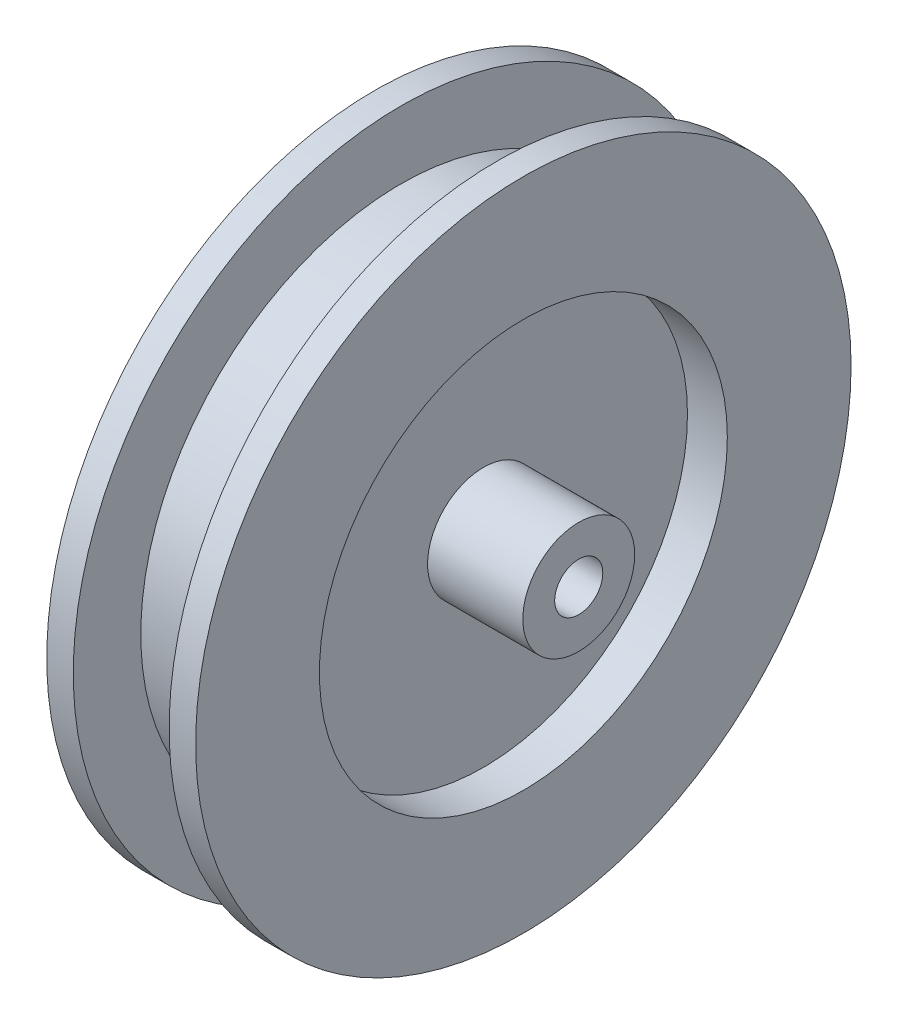
ISO-10303-21;
HEADER;
FILE_DESCRIPTION(('STEP AP214'),'2;1');
FILE_NAME('part.step','',(''),(''),'','','');
FILE_SCHEMA(('AUTOMOTIVE_DESIGN { 1 0 10303 214 1 1 1 1 }'));
ENDSEC;
DATA;
#1=APPLICATION_CONTEXT('core data for automotive mechanical design processes');
#2=APPLICATION_PROTOCOL_DEFINITION('international standard','automotive_design',2000,#1);
#3=PRODUCT_CONTEXT('',#1,'mechanical');
#4=PRODUCT('Part','Part','',(#3));
#5=PRODUCT_RELATED_PRODUCT_CATEGORY('part','',(#4));
#6=PRODUCT_DEFINITION_FORMATION('','',#4);
#7=PRODUCT_DEFINITION_CONTEXT('part definition',#1,'design');
#8=PRODUCT_DEFINITION('design','',#6,#7);
#9=PRODUCT_DEFINITION_SHAPE('','',#8);
#10=(LENGTH_UNIT() NAMED_UNIT(*) SI_UNIT(.MILLI.,.METRE.));
#11=(NAMED_UNIT(*) PLANE_ANGLE_UNIT() SI_UNIT($,.RADIAN.));
#12=(NAMED_UNIT(*) SI_UNIT($,.STERADIAN.) SOLID_ANGLE_UNIT());
#13=UNCERTAINTY_MEASURE_WITH_UNIT(LENGTH_MEASURE(1.E-05),#10,'distance_accuracy_value','');
#14=(GEOMETRIC_REPRESENTATION_CONTEXT(3) GLOBAL_UNCERTAINTY_ASSIGNED_CONTEXT((#13)) GLOBAL_UNIT_ASSIGNED_CONTEXT((#10,
#11,#12)) REPRESENTATION_CONTEXT('',''));
#15=CARTESIAN_POINT('',(0.,0.,0.));
#16=DIRECTION('',(0.,0.,1.));
#17=DIRECTION('',(1.,0.,0.));
#18=AXIS2_PLACEMENT_3D('',#15,#16,#17);
#19=CARTESIAN_POINT('',(8.0518,0.,0.));
#20=DIRECTION('',(1.,0.,0.));
#21=DIRECTION('',(0.,0.,-1.));
#22=AXIS2_PLACEMENT_3D('',#19,#20,#21);
#23=PLANE('',#22);
#24=CARTESIAN_POINT('',(8.0518,0.,0.));
#25=DIRECTION('',(1.,0.,0.));
#26=DIRECTION('',(0.,0.,-1.));
#27=AXIS2_PLACEMENT_3D('',#24,#25,#26);
#28=CIRCLE('',#27,47.46625);
#29=CARTESIAN_POINT('',(8.0518,0.,-47.46625));
#30=VERTEX_POINT('',#29);
#31=EDGE_CURVE('E48',#30,#30,#28,.T.);
#32=ORIENTED_EDGE('',*,*,#31,.T.);
#33=EDGE_LOOP('',(#32));
#34=FACE_BOUND('',#33,.T.);
#35=CARTESIAN_POINT('',(8.0518,0.,0.));
#36=DIRECTION('',(1.,0.,0.));
#37=DIRECTION('',(0.,0.,-1.));
#38=AXIS2_PLACEMENT_3D('',#35,#36,#37);
#39=CIRCLE('',#38,13.0175);
#40=CARTESIAN_POINT('',(8.0518,0.,-13.0175));
#41=VERTEX_POINT('',#40);
#42=EDGE_CURVE('E139',#41,#41,#39,.T.);
#43=ORIENTED_EDGE('',*,*,#42,.F.);
#44=EDGE_LOOP('',(#43));
#45=FACE_BOUND('',#44,.T.);
#46=ADVANCED_FACE('F35',(#34,#45),#23,.T.);
#47=CARTESIAN_POINT('',(17.3228,0.,0.));
#48=DIRECTION('',(-1.,0.,0.));
#49=DIRECTION('',(0.,0.,1.));
#50=AXIS2_PLACEMENT_3D('',#47,#48,#49);
#51=CYLINDRICAL_SURFACE('',#50,76.2635);
#52=CARTESIAN_POINT('',(11.1506,0.,0.));
#53=DIRECTION('',(1.,0.,0.));
#54=DIRECTION('',(0.,0.,-1.));
#55=AXIS2_PLACEMENT_3D('',#52,#53,#54);
#56=CIRCLE('',#55,76.2635);
#57=CARTESIAN_POINT('',(11.1506,0.,-76.2635));
#58=VERTEX_POINT('',#57);
#59=EDGE_CURVE('E39',#58,#58,#56,.T.);
#60=ORIENTED_EDGE('',*,*,#59,.T.);
#61=EDGE_LOOP('',(#60));
#62=FACE_BOUND('',#61,.T.);
#63=CARTESIAN_POINT('',(17.3228,0.,0.));
#64=DIRECTION('',(1.,0.,0.));
#65=DIRECTION('',(0.,0.,-1.));
#66=AXIS2_PLACEMENT_3D('',#63,#64,#65);
#67=CIRCLE('',#66,76.2635);
#68=CARTESIAN_POINT('',(17.3228,0.,-76.2635));
#69=VERTEX_POINT('',#68);
#70=EDGE_CURVE('E12',#69,#69,#67,.T.);
#71=ORIENTED_EDGE('',*,*,#70,.F.);
#72=EDGE_LOOP('',(#71));
#73=FACE_BOUND('',#72,.T.);
#74=ADVANCED_FACE('F37',(#62,#73),#51,.T.);
#75=CARTESIAN_POINT('',(17.3228,0.,0.));
#76=DIRECTION('',(1.,0.,0.));
#77=DIRECTION('',(0.,0.,-1.));
#78=AXIS2_PLACEMENT_3D('',#75,#76,#77);
#79=PLANE('',#78);
#80=CARTESIAN_POINT('',(17.3228,0.,0.));
#81=DIRECTION('',(1.,0.,0.));
#82=DIRECTION('',(0.,0.,-1.));
#83=AXIS2_PLACEMENT_3D('',#80,#81,#82);
#84=CIRCLE('',#83,47.46625);
#85=CARTESIAN_POINT('',(17.3228,0.,-47.46625));
#86=VERTEX_POINT('',#85);
#87=EDGE_CURVE('E51',#86,#86,#84,.T.);
#88=ORIENTED_EDGE('',*,*,#87,.F.);
#89=EDGE_LOOP('',(#88));
#90=FACE_BOUND('',#89,.T.);
#91=ORIENTED_EDGE('',*,*,#70,.T.);
#92=EDGE_LOOP('',(#91));
#93=FACE_BOUND('',#92,.T.);
#94=ADVANCED_FACE('F82',(#90,#93),#79,.T.);
#95=CARTESIAN_POINT('',(8.0518,0.,0.));
#96=DIRECTION('',(1.,0.,0.));
#97=DIRECTION('',(0.,0.,-1.));
#98=AXIS2_PLACEMENT_3D('',#95,#96,#97);
#99=CYLINDRICAL_SURFACE('',#98,47.46625);
#100=ORIENTED_EDGE('',*,*,#31,.F.);
#101=EDGE_LOOP('',(#100));
#102=FACE_BOUND('',#101,.T.);
#103=ORIENTED_EDGE('',*,*,#87,.T.);
#104=EDGE_LOOP('',(#103));
#105=FACE_BOUND('',#104,.T.);
#106=ADVANCED_FACE('F80',(#102,#105),#99,.F.);
#107=CARTESIAN_POINT('',(11.1506,0.,0.));
#108=DIRECTION('',(1.,0.,0.));
#109=DIRECTION('',(0.,0.,-1.));
#110=AXIS2_PLACEMENT_3D('',#107,#108,#109);
#111=PLANE('',#110);
#112=CARTESIAN_POINT('',(11.1506,0.,0.));
#113=DIRECTION('',(1.,0.,0.));
#114=DIRECTION('',(0.,0.,-1.));
#115=AXIS2_PLACEMENT_3D('',#112,#113,#114);
#116=CIRCLE('',#115,60.5536);
#117=CARTESIAN_POINT('',(11.1506,0.,-60.5536));
#118=VERTEX_POINT('',#117);
#119=EDGE_CURVE('E61',#118,#118,#116,.T.);
#120=ORIENTED_EDGE('',*,*,#119,.T.);
#121=EDGE_LOOP('',(#120));
#122=FACE_BOUND('',#121,.T.);
#123=ORIENTED_EDGE('',*,*,#59,.F.);
#124=EDGE_LOOP('',(#123));
#125=FACE_BOUND('',#124,.T.);
#126=ADVANCED_FACE('F89',(#122,#125),#111,.F.);
#127=CARTESIAN_POINT('',(-11.1506,0.,0.));
#128=DIRECTION('',(1.,0.,0.));
#129=DIRECTION('',(0.,0.,-1.));
#130=AXIS2_PLACEMENT_3D('',#127,#128,#129);
#131=PLANE('',#130);
#132=CARTESIAN_POINT('',(-11.1506,0.,0.));
#133=DIRECTION('',(1.,0.,0.));
#134=DIRECTION('',(0.,0.,-1.));
#135=AXIS2_PLACEMENT_3D('',#132,#133,#134);
#136=CIRCLE('',#135,60.5536);
#137=CARTESIAN_POINT('',(-11.1506,0.,-60.5536));
#138=VERTEX_POINT('',#137);
#139=EDGE_CURVE('E55',#138,#138,#136,.F.);
#140=ORIENTED_EDGE('',*,*,#139,.T.);
#141=EDGE_LOOP('',(#140));
#142=FACE_BOUND('',#141,.T.);
#143=CARTESIAN_POINT('',(-11.1506,0.,0.));
#144=DIRECTION('',(1.,0.,0.));
#145=DIRECTION('',(0.,0.,-1.));
#146=AXIS2_PLACEMENT_3D('',#143,#144,#145);
#147=CIRCLE('',#146,76.2635);
#148=CARTESIAN_POINT('',(-11.1506,0.,-76.2635));
#149=VERTEX_POINT('',#148);
#150=EDGE_CURVE('E53',#149,#149,#147,.T.);
#151=ORIENTED_EDGE('',*,*,#150,.T.);
#152=EDGE_LOOP('',(#151));
#153=FACE_BOUND('',#152,.T.);
#154=ADVANCED_FACE('F112',(#142,#153),#131,.T.);
#155=CARTESIAN_POINT('',(-236.913180618821,0.,0.));
#156=DIRECTION('',(1.,0.,0.));
#157=DIRECTION('',(0.,0.,-1.));
#158=AXIS2_PLACEMENT_3D('',#155,#156,#157);
#159=CYLINDRICAL_SURFACE('',#158,60.5536);
#160=ORIENTED_EDGE('',*,*,#139,.F.);
#161=EDGE_LOOP('',(#160));
#162=FACE_BOUND('',#161,.T.);
#163=ORIENTED_EDGE('',*,*,#119,.F.);
#164=EDGE_LOOP('',(#163));
#165=FACE_BOUND('',#164,.T.);
#166=ADVANCED_FACE('F108',(#162,#165),#159,.T.);
#167=CARTESIAN_POINT('',(1.4732,0.,0.));
#168=DIRECTION('',(1.,0.,0.));
#169=DIRECTION('',(0.,0.,-1.));
#170=AXIS2_PLACEMENT_3D('',#167,#168,#169);
#171=PLANE('',#170);
#172=CARTESIAN_POINT('',(1.4732,0.,0.));
#173=DIRECTION('',(1.,0.,0.));
#174=DIRECTION('',(0.,0.,-1.));
#175=AXIS2_PLACEMENT_3D('',#172,#173,#174);
#176=CIRCLE('',#175,5.59435);
#177=CARTESIAN_POINT('',(1.4732,0.,-5.59435));
#178=VERTEX_POINT('',#177);
#179=EDGE_CURVE('E138',#178,#178,#176,.T.);
#180=ORIENTED_EDGE('',*,*,#179,.T.);
#181=EDGE_LOOP('',(#180));
#182=FACE_BOUND('',#181,.T.);
#183=CARTESIAN_POINT('',(1.4732,0.,0.));
#184=DIRECTION('',(1.,0.,0.));
#185=DIRECTION('',(0.,0.,-1.));
#186=AXIS2_PLACEMENT_3D('',#183,#184,#185);
#187=CIRCLE('',#186,47.46625);
#188=CARTESIAN_POINT('',(1.4732,0.,-47.46625));
#189=VERTEX_POINT('',#188);
#190=EDGE_CURVE('E70',#189,#189,#187,.T.);
#191=ORIENTED_EDGE('',*,*,#190,.F.);
#192=EDGE_LOOP('',(#191));
#193=FACE_BOUND('',#192,.T.);
#194=ADVANCED_FACE('F104',(#182,#193),#171,.F.);
#195=CARTESIAN_POINT('',(1.4732,0.,0.));
#196=DIRECTION('',(-1.,0.,0.));
#197=DIRECTION('',(0.,0.,1.));
#198=AXIS2_PLACEMENT_3D('',#195,#196,#197);
#199=CYLINDRICAL_SURFACE('',#198,47.46625);
#200=ORIENTED_EDGE('',*,*,#190,.T.);
#201=EDGE_LOOP('',(#200));
#202=FACE_BOUND('',#201,.T.);
#203=CARTESIAN_POINT('',(-17.3228,0.,0.));
#204=DIRECTION('',(1.,0.,0.));
#205=DIRECTION('',(0.,0.,-1.));
#206=AXIS2_PLACEMENT_3D('',#203,#204,#205);
#207=CIRCLE('',#206,47.46625);
#208=CARTESIAN_POINT('',(-17.3228,0.,-47.46625));
#209=VERTEX_POINT('',#208);
#210=EDGE_CURVE('E59',#209,#209,#207,.T.);
#211=ORIENTED_EDGE('',*,*,#210,.F.);
#212=EDGE_LOOP('',(#211));
#213=FACE_BOUND('',#212,.T.);
#214=ADVANCED_FACE('F100',(#202,#213),#199,.F.);
#215=CARTESIAN_POINT('',(-17.3228,0.,0.));
#216=DIRECTION('',(1.,0.,0.));
#217=DIRECTION('',(0.,0.,-1.));
#218=AXIS2_PLACEMENT_3D('',#215,#216,#217);
#219=PLANE('',#218);
#220=CARTESIAN_POINT('',(-17.3228,0.,0.));
#221=DIRECTION('',(1.,0.,0.));
#222=DIRECTION('',(0.,0.,-1.));
#223=AXIS2_PLACEMENT_3D('',#220,#221,#222);
#224=CIRCLE('',#223,76.2635);
#225=CARTESIAN_POINT('',(-17.3228,0.,-76.2635));
#226=VERTEX_POINT('',#225);
#227=EDGE_CURVE('E43',#226,#226,#224,.T.);
#228=ORIENTED_EDGE('',*,*,#227,.F.);
#229=EDGE_LOOP('',(#228));
#230=FACE_BOUND('',#229,.T.);
#231=ORIENTED_EDGE('',*,*,#210,.T.);
#232=EDGE_LOOP('',(#231));
#233=FACE_BOUND('',#232,.T.);
#234=ADVANCED_FACE('F103',(#230,#233),#219,.F.);
#235=ORIENTED_EDGE('',*,*,#227,.T.);
#236=EDGE_LOOP('',(#235));
#237=FACE_BOUND('',#236,.T.);
#238=ORIENTED_EDGE('',*,*,#150,.F.);
#239=EDGE_LOOP('',(#238));
#240=FACE_BOUND('',#239,.T.);
#241=ADVANCED_FACE('F93',(#237,#240),#51,.T.);
#242=CARTESIAN_POINT('',(30.2133,0.,0.));
#243=DIRECTION('',(-1.,0.,0.));
#244=DIRECTION('',(0.,0.,1.));
#245=AXIS2_PLACEMENT_3D('',#242,#243,#244);
#246=CYLINDRICAL_SURFACE('',#245,13.0175);
#247=CARTESIAN_POINT('',(30.2133,0.,0.));
#248=DIRECTION('',(1.,0.,0.));
#249=DIRECTION('',(0.,0.,-1.));
#250=AXIS2_PLACEMENT_3D('',#247,#248,#249);
#251=CIRCLE('',#250,13.0175);
#252=CARTESIAN_POINT('',(30.2133,0.,-13.0175));
#253=VERTEX_POINT('',#252);
#254=EDGE_CURVE('E66',#253,#253,#251,.T.);
#255=ORIENTED_EDGE('',*,*,#254,.F.);
#256=EDGE_LOOP('',(#255));
#257=FACE_BOUND('',#256,.T.);
#258=ORIENTED_EDGE('',*,*,#42,.T.);
#259=EDGE_LOOP('',(#258));
#260=FACE_BOUND('',#259,.T.);
#261=ADVANCED_FACE('F119',(#257,#260),#246,.T.);
#262=CARTESIAN_POINT('',(30.2133,0.,0.));
#263=DIRECTION('',(1.,0.,0.));
#264=DIRECTION('',(0.,0.,-1.));
#265=AXIS2_PLACEMENT_3D('',#262,#263,#264);
#266=PLANE('',#265);
#267=CARTESIAN_POINT('',(30.2133,0.,0.));
#268=DIRECTION('',(1.,0.,0.));
#269=DIRECTION('',(0.,0.,-1.));
#270=AXIS2_PLACEMENT_3D('',#267,#268,#269);
#271=CIRCLE('',#270,5.59435);
#272=CARTESIAN_POINT('',(30.2133,0.,-5.59435));
#273=VERTEX_POINT('',#272);
#274=EDGE_CURVE('E135',#273,#273,#271,.T.);
#275=ORIENTED_EDGE('',*,*,#274,.F.);
#276=EDGE_LOOP('',(#275));
#277=FACE_BOUND('',#276,.T.);
#278=ORIENTED_EDGE('',*,*,#254,.T.);
#279=EDGE_LOOP('',(#278));
#280=FACE_BOUND('',#279,.T.);
#281=ADVANCED_FACE('F122',(#277,#280),#266,.T.);
#282=CARTESIAN_POINT('',(-17.3228,0.,0.));
#283=DIRECTION('',(1.,0.,0.));
#284=DIRECTION('',(0.,0.,-1.));
#285=AXIS2_PLACEMENT_3D('',#282,#283,#284);
#286=CYLINDRICAL_SURFACE('',#285,5.59435);
#287=CARTESIAN_POINT('',(30.2133,0.,-5.59435));
#288=CARTESIAN_POINT('',(29.9139239583333,0.,-5.59435));
#289=CARTESIAN_POINT('',(29.6145479166667,0.,-5.59435));
#290=CARTESIAN_POINT('',(29.0157958333333,0.,-5.59435));
#291=CARTESIAN_POINT('',(28.7164197916667,0.,-5.59435));
#292=CARTESIAN_POINT('',(28.1176677083333,0.,-5.59435));
#293=CARTESIAN_POINT('',(27.8182916666667,0.,-5.59435));
#294=CARTESIAN_POINT('',(27.2195395833333,0.,-5.59435));
#295=CARTESIAN_POINT('',(26.9201635416667,0.,-5.59435));
#296=CARTESIAN_POINT('',(26.3214114583333,0.,-5.59435));
#297=CARTESIAN_POINT('',(26.0220354166667,0.,-5.59435));
#298=CARTESIAN_POINT('',(25.4232833333333,0.,-5.59435));
#299=CARTESIAN_POINT('',(25.1239072916667,0.,-5.59435));
#300=CARTESIAN_POINT('',(24.5251552083333,0.,-5.59435));
#301=CARTESIAN_POINT('',(24.2257791666667,0.,-5.59435));
#302=CARTESIAN_POINT('',(23.6270270833333,0.,-5.59435));
#303=CARTESIAN_POINT('',(23.3276510416667,0.,-5.59435));
#304=CARTESIAN_POINT('',(22.7288989583333,0.,-5.59435));
#305=CARTESIAN_POINT('',(22.4295229166667,0.,-5.59435));
#306=CARTESIAN_POINT('',(21.8307708333333,0.,-5.59435));
#307=CARTESIAN_POINT('',(21.5313947916667,0.,-5.59435));
#308=CARTESIAN_POINT('',(20.9326427083333,0.,-5.59435));
#309=CARTESIAN_POINT('',(20.6332666666667,0.,-5.59435));
#310=CARTESIAN_POINT('',(20.0345145833333,0.,-5.59435));
#311=CARTESIAN_POINT('',(19.7351385416667,0.,-5.59435));
#312=CARTESIAN_POINT('',(19.1363864583333,0.,-5.59435));
#313=CARTESIAN_POINT('',(18.8370104166667,0.,-5.59435));
#314=CARTESIAN_POINT('',(18.2382583333333,0.,-5.59435));
#315=CARTESIAN_POINT('',(17.9388822916667,0.,-5.59435));
#316=CARTESIAN_POINT('',(17.3401302083333,0.,-5.59435));
#317=CARTESIAN_POINT('',(17.0407541666667,0.,-5.59435));
#318=CARTESIAN_POINT('',(16.4420020833333,0.,-5.59435));
#319=CARTESIAN_POINT('',(16.1426260416667,0.,-5.59435));
#320=CARTESIAN_POINT('',(15.5438739583333,0.,-5.59435));
#321=CARTESIAN_POINT('',(15.2444979166667,0.,-5.59435));
#322=CARTESIAN_POINT('',(14.6457458333333,0.,-5.59435));
#323=CARTESIAN_POINT('',(14.3463697916667,0.,-5.59435));
#324=CARTESIAN_POINT('',(13.7476177083333,0.,-5.59435));
#325=CARTESIAN_POINT('',(13.4482416666667,0.,-5.59435));
#326=CARTESIAN_POINT('',(12.8494895833333,0.,-5.59435));
#327=CARTESIAN_POINT('',(12.5501135416667,0.,-5.59435));
#328=CARTESIAN_POINT('',(11.9513614583333,0.,-5.59435));
#329=CARTESIAN_POINT('',(11.6519854166667,0.,-5.59435));
#330=CARTESIAN_POINT('',(11.0532333333333,0.,-5.59435));
#331=CARTESIAN_POINT('',(10.7538572916667,0.,-5.59435));
#332=CARTESIAN_POINT('',(10.1551052083333,0.,-5.59435));
#333=CARTESIAN_POINT('',(9.85572916666666,0.,-5.59435));
#334=CARTESIAN_POINT('',(9.25697708333333,0.,-5.59435));
#335=CARTESIAN_POINT('',(8.95760104166666,0.,-5.59435));
#336=CARTESIAN_POINT('',(8.35884895833333,0.,-5.59435));
#337=CARTESIAN_POINT('',(8.05947291666666,0.,-5.59435));
#338=CARTESIAN_POINT('',(7.46072083333333,0.,-5.59435));
#339=CARTESIAN_POINT('',(7.16134479166666,0.,-5.59435));
#340=CARTESIAN_POINT('',(6.56259270833333,0.,-5.59435));
#341=CARTESIAN_POINT('',(6.26321666666666,0.,-5.59435));
#342=CARTESIAN_POINT('',(5.66446458333333,0.,-5.59435));
#343=CARTESIAN_POINT('',(5.36508854166666,0.,-5.59435));
#344=CARTESIAN_POINT('',(4.76633645833333,0.,-5.59435));
#345=CARTESIAN_POINT('',(4.46696041666666,0.,-5.59435));
#346=CARTESIAN_POINT('',(3.86820833333333,0.,-5.59435));
#347=CARTESIAN_POINT('',(3.56883229166666,0.,-5.59435));
#348=CARTESIAN_POINT('',(2.97008020833333,0.,-5.59435));
#349=CARTESIAN_POINT('',(2.67070416666666,0.,-5.59435));
#350=CARTESIAN_POINT('',(2.07195208333333,0.,-5.59435));
#351=CARTESIAN_POINT('',(1.77257604166666,0.,-5.59435));
#352=CARTESIAN_POINT('',(1.4732,0.,-5.59435));
#353=B_SPLINE_CURVE_WITH_KNOTS('',3,(#287,#288,#289,#290,#291,#292,#293,#294,#295,#296,#297,
#298,#299,#300,#301,#302,#303,#304,#305,#306,#307,#308,#309,#310,#311,#312,#313,#314,#315,#316,
#317,#318,#319,#320,#321,#322,#323,#324,#325,#326,#327,#328,#329,#330,#331,#332,#333,#334,#335,
#336,#337,#338,#339,#340,#341,#342,#343,#344,#345,#346,#347,#348,#349,#350,#351,#352),
.UNSPECIFIED.,.F.,.F.,(4,2,2,2,2,2,2,2,2,2,2,2,2,2,2,2,2,2,2,2,2,2,2,2,2,2,2,2,2,2,2,2,4),(0.,
0.898128125000001,1.79625625,2.694384375,3.5925125,4.490640625,5.38876875,6.286896875,7.185025,
8.083153125,8.98128125,9.87940937499999,10.7775375,11.675665625,12.57379375,13.471921875,
14.37005,15.268178125,16.16630625,17.064434375,17.9625625,18.860690625,19.75881875,20.656946875,
21.555075,22.453203125,23.35133125,24.249459375,25.1475875,26.045715625,26.94384375,
27.841971875,28.7401),.UNSPECIFIED.);
#354=EDGE_CURVE('BSEAM126',#273,#178,#353,.T.);
#355=ORIENTED_EDGE('',*,*,#274,.T.);
#356=ORIENTED_EDGE('',*,*,#179,.F.);
#357=ORIENTED_EDGE('',*,*,#354,.T.);
#358=ORIENTED_EDGE('',*,*,#354,.F.);
#359=EDGE_LOOP('',(#355,#357,#356,#358));
#360=FACE_BOUND('',#359,.T.);
#361=ADVANCED_FACE('F126',(#360),#286,.F.);
#362=CLOSED_SHELL('',(#46,#74,#94,#106,#126,#154,#166,#194,#214,#234,#241,#261,#281,#361));
#363=MANIFOLD_SOLID_BREP('B2',#362);
#364=ADVANCED_BREP_SHAPE_REPRESENTATION('',(#18,#363),#14);
#365=SHAPE_DEFINITION_REPRESENTATION(#9,#364);
ENDSEC;
END-ISO-10303-21;
